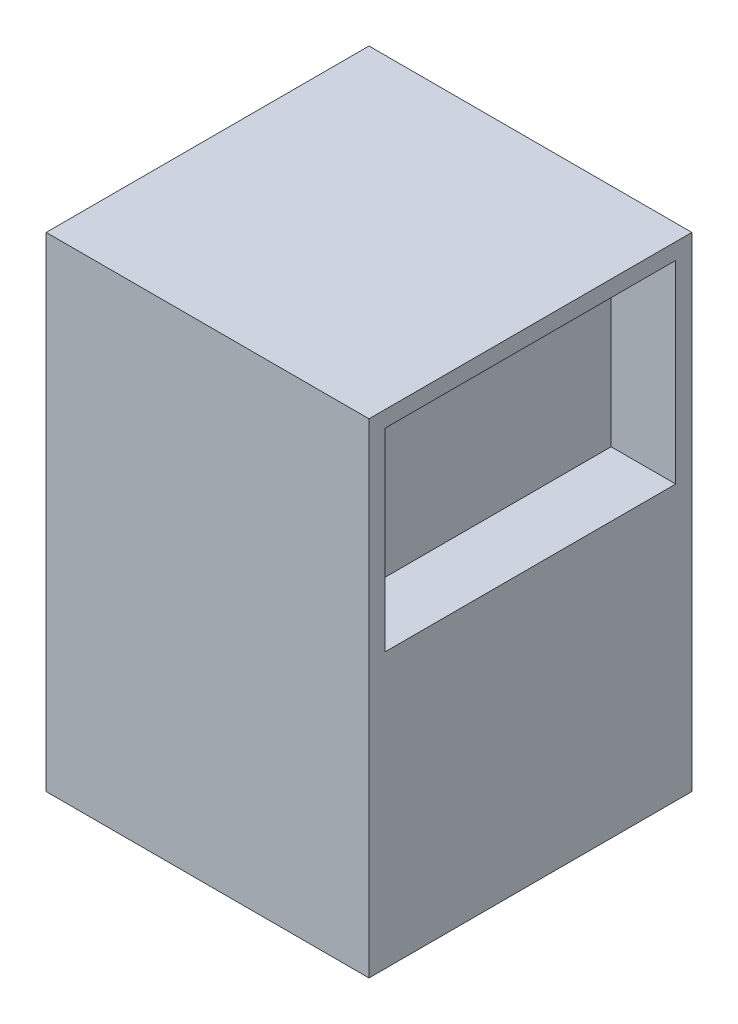
ISO-10303-21;
HEADER;
FILE_DESCRIPTION(('STEP AP214'),'2;1');
FILE_NAME('part.step','',(''),(''),'','','');
FILE_SCHEMA(('AUTOMOTIVE_DESIGN { 1 0 10303 214 1 1 1 1 }'));
ENDSEC;
DATA;
#1=APPLICATION_CONTEXT('core data for automotive mechanical design processes');
#2=APPLICATION_PROTOCOL_DEFINITION('international standard','automotive_design',2000,#1);
#3=PRODUCT_CONTEXT('',#1,'mechanical');
#4=PRODUCT('Part','Part','',(#3));
#5=PRODUCT_RELATED_PRODUCT_CATEGORY('part','',(#4));
#6=PRODUCT_DEFINITION_FORMATION('','',#4);
#7=PRODUCT_DEFINITION_CONTEXT('part definition',#1,'design');
#8=PRODUCT_DEFINITION('design','',#6,#7);
#9=PRODUCT_DEFINITION_SHAPE('','',#8);
#10=(LENGTH_UNIT() NAMED_UNIT(*) SI_UNIT(.MILLI.,.METRE.));
#11=(NAMED_UNIT(*) PLANE_ANGLE_UNIT() SI_UNIT($,.RADIAN.));
#12=(NAMED_UNIT(*) SI_UNIT($,.STERADIAN.) SOLID_ANGLE_UNIT());
#13=UNCERTAINTY_MEASURE_WITH_UNIT(LENGTH_MEASURE(1.E-05),#10,'distance_accuracy_value','');
#14=(GEOMETRIC_REPRESENTATION_CONTEXT(3) GLOBAL_UNCERTAINTY_ASSIGNED_CONTEXT((#13)) GLOBAL_UNIT_ASSIGNED_CONTEXT((#10,
#11,#12)) REPRESENTATION_CONTEXT('',''));
#15=CARTESIAN_POINT('',(0.,0.,0.));
#16=DIRECTION('',(0.,0.,1.));
#17=DIRECTION('',(1.,0.,0.));
#18=AXIS2_PLACEMENT_3D('',#15,#16,#17);
#19=CARTESIAN_POINT('',(-5.,8.82209169026397,-5.));
#20=DIRECTION('',(-1.,0.,0.));
#21=DIRECTION('',(0.,-1.,0.));
#22=AXIS2_PLACEMENT_3D('',#19,#20,#21);
#23=PLANE('',#22);
#24=DIRECTION('',(0.,0.,1.));
#25=VECTOR('',#24,1.);
#26=CARTESIAN_POINT('',(-5.,-6.17790830973602,-5.));
#27=LINE('',#26,#25);
#28=CARTESIAN_POINT('',(-5.,-6.17790830973602,-5.));
#29=VERTEX_POINT('',#28);
#30=CARTESIAN_POINT('',(-5.,-6.17790830973602,5.));
#31=VERTEX_POINT('',#30);
#32=EDGE_CURVE('E46',#29,#31,#27,.T.);
#33=ORIENTED_EDGE('',*,*,#32,.T.);
#34=DIRECTION('',(0.,-1.,0.));
#35=VECTOR('',#34,1.);
#36=CARTESIAN_POINT('',(-5.,8.82209169026397,5.));
#37=LINE('',#36,#35);
#38=CARTESIAN_POINT('',(-5.,8.82209169026397,5.));
#39=VERTEX_POINT('',#38);
#40=EDGE_CURVE('E154',#39,#31,#37,.T.);
#41=ORIENTED_EDGE('',*,*,#40,.F.);
#42=DIRECTION('',(0.,0.,1.));
#43=VECTOR('',#42,1.);
#44=CARTESIAN_POINT('',(-5.,8.82209169026397,-5.));
#45=LINE('',#44,#43);
#46=CARTESIAN_POINT('',(-5.,8.82209169026397,-5.));
#47=VERTEX_POINT('',#46);
#48=EDGE_CURVE('E11',#47,#39,#45,.T.);
#49=ORIENTED_EDGE('',*,*,#48,.F.);
#50=DIRECTION('',(0.,-1.,0.));
#51=VECTOR('',#50,1.);
#52=CARTESIAN_POINT('',(-5.,8.82209169026397,-5.));
#53=LINE('',#52,#51);
#54=EDGE_CURVE('E175',#47,#29,#53,.T.);
#55=ORIENTED_EDGE('',*,*,#54,.T.);
#56=EDGE_LOOP('',(#33,#41,#49,#55));
#57=FACE_BOUND('',#56,.T.);
#58=ADVANCED_FACE('F43',(#57),#23,.T.);
#59=CARTESIAN_POINT('',(-5.,8.82209169026397,-5.));
#60=DIRECTION('',(0.,1.,0.));
#61=DIRECTION('',(-1.,0.,0.));
#62=AXIS2_PLACEMENT_3D('',#59,#60,#61);
#63=PLANE('',#62);
#64=ORIENTED_EDGE('',*,*,#48,.T.);
#65=DIRECTION('',(-1.,0.,0.));
#66=VECTOR('',#65,1.);
#67=CARTESIAN_POINT('',(-5.,8.82209169026397,5.));
#68=LINE('',#67,#66);
#69=CARTESIAN_POINT('',(5.,8.82209169026397,5.));
#70=VERTEX_POINT('',#69);
#71=EDGE_CURVE('E171',#70,#39,#68,.T.);
#72=ORIENTED_EDGE('',*,*,#71,.F.);
#73=DIRECTION('',(0.,0.,1.));
#74=VECTOR('',#73,1.);
#75=CARTESIAN_POINT('',(5.,8.82209169026397,-5.));
#76=LINE('',#75,#74);
#77=CARTESIAN_POINT('',(5.,8.82209169026397,-5.));
#78=VERTEX_POINT('',#77);
#79=EDGE_CURVE('E52',#78,#70,#76,.T.);
#80=ORIENTED_EDGE('',*,*,#79,.F.);
#81=DIRECTION('',(-1.,0.,0.));
#82=VECTOR('',#81,1.);
#83=CARTESIAN_POINT('',(-5.,8.82209169026397,-5.));
#84=LINE('',#83,#82);
#85=EDGE_CURVE('E186',#78,#47,#84,.T.);
#86=ORIENTED_EDGE('',*,*,#85,.T.);
#87=EDGE_LOOP('',(#64,#72,#80,#86));
#88=FACE_BOUND('',#87,.T.);
#89=ADVANCED_FACE('F203',(#88),#63,.T.);
#90=CARTESIAN_POINT('',(5.,8.82209169026397,-5.));
#91=DIRECTION('',(1.,0.,0.));
#92=DIRECTION('',(0.,1.,0.));
#93=AXIS2_PLACEMENT_3D('',#90,#91,#92);
#94=PLANE('',#93);
#95=DIRECTION('',(0.,-1.,0.));
#96=VECTOR('',#95,1.);
#97=CARTESIAN_POINT('',(5.,8.32209169026397,4.5));
#98=LINE('',#97,#96);
#99=CARTESIAN_POINT('',(5.,8.32209169026397,4.5));
#100=VERTEX_POINT('',#99);
#101=CARTESIAN_POINT('',(5.,2.32209169026397,4.5));
#102=VERTEX_POINT('',#101);
#103=EDGE_CURVE('E60',#100,#102,#98,.T.);
#104=ORIENTED_EDGE('',*,*,#103,.F.);
#105=DIRECTION('',(0.,0.,1.));
#106=VECTOR('',#105,1.);
#107=CARTESIAN_POINT('',(5.,8.32209169026397,4.5));
#108=LINE('',#107,#106);
#109=CARTESIAN_POINT('',(5.,8.32209169026397,-4.5));
#110=VERTEX_POINT('',#109);
#111=EDGE_CURVE('E132',#110,#100,#108,.T.);
#112=ORIENTED_EDGE('',*,*,#111,.F.);
#113=DIRECTION('',(0.,1.,0.));
#114=VECTOR('',#113,1.);
#115=CARTESIAN_POINT('',(5.,8.32209169026397,-4.5));
#116=LINE('',#115,#114);
#117=CARTESIAN_POINT('',(5.,2.32209169026397,-4.5));
#118=VERTEX_POINT('',#117);
#119=EDGE_CURVE('E136',#118,#110,#116,.T.);
#120=ORIENTED_EDGE('',*,*,#119,.F.);
#121=DIRECTION('',(0.,0.,-1.));
#122=VECTOR('',#121,1.);
#123=CARTESIAN_POINT('',(5.,2.32209169026397,4.5));
#124=LINE('',#123,#122);
#125=EDGE_CURVE('E145',#102,#118,#124,.T.);
#126=ORIENTED_EDGE('',*,*,#125,.F.);
#127=EDGE_LOOP('',(#104,#112,#120,#126));
#128=FACE_BOUND('',#127,.T.);
#129=ORIENTED_EDGE('',*,*,#79,.T.);
#130=DIRECTION('',(0.,1.,0.));
#131=VECTOR('',#130,1.);
#132=CARTESIAN_POINT('',(5.,8.82209169026397,5.));
#133=LINE('',#132,#131);
#134=CARTESIAN_POINT('',(5.,-6.17790830973602,5.));
#135=VERTEX_POINT('',#134);
#136=EDGE_CURVE('E167',#135,#70,#133,.T.);
#137=ORIENTED_EDGE('',*,*,#136,.F.);
#138=DIRECTION('',(0.,0.,1.));
#139=VECTOR('',#138,1.);
#140=CARTESIAN_POINT('',(5.,-6.17790830973602,-5.));
#141=LINE('',#140,#139);
#142=CARTESIAN_POINT('',(5.,-6.17790830973602,-5.));
#143=VERTEX_POINT('',#142);
#144=EDGE_CURVE('E191',#143,#135,#141,.T.);
#145=ORIENTED_EDGE('',*,*,#144,.F.);
#146=DIRECTION('',(0.,1.,0.));
#147=VECTOR('',#146,1.);
#148=CARTESIAN_POINT('',(5.,8.82209169026397,-5.));
#149=LINE('',#148,#147);
#150=EDGE_CURVE('E182',#143,#78,#149,.T.);
#151=ORIENTED_EDGE('',*,*,#150,.T.);
#152=EDGE_LOOP('',(#129,#137,#145,#151));
#153=FACE_BOUND('',#152,.T.);
#154=ADVANCED_FACE('F209',(#128,#153),#94,.T.);
#155=CARTESIAN_POINT('',(-5.,-6.17790830973602,-5.));
#156=DIRECTION('',(0.,-1.,0.));
#157=DIRECTION('',(0.,0.,-1.));
#158=AXIS2_PLACEMENT_3D('',#155,#156,#157);
#159=PLANE('',#158);
#160=ORIENTED_EDGE('',*,*,#144,.T.);
#161=DIRECTION('',(1.,0.,0.));
#162=VECTOR('',#161,1.);
#163=CARTESIAN_POINT('',(-5.,-6.17790830973602,5.));
#164=LINE('',#163,#162);
#165=EDGE_CURVE('E163',#31,#135,#164,.T.);
#166=ORIENTED_EDGE('',*,*,#165,.F.);
#167=ORIENTED_EDGE('',*,*,#32,.F.);
#168=DIRECTION('',(1.,0.,0.));
#169=VECTOR('',#168,1.);
#170=CARTESIAN_POINT('',(-5.,-6.17790830973602,-5.));
#171=LINE('',#170,#169);
#172=EDGE_CURVE('E178',#29,#143,#171,.T.);
#173=ORIENTED_EDGE('',*,*,#172,.T.);
#174=EDGE_LOOP('',(#160,#166,#167,#173));
#175=FACE_BOUND('',#174,.T.);
#176=ADVANCED_FACE('F197',(#175),#159,.T.);
#177=CARTESIAN_POINT('',(0.,0.,-5.));
#178=DIRECTION('',(0.,0.,1.));
#179=DIRECTION('',(1.,0.,0.));
#180=AXIS2_PLACEMENT_3D('',#177,#178,#179);
#181=PLANE('',#180);
#182=ORIENTED_EDGE('',*,*,#54,.F.);
#183=ORIENTED_EDGE('',*,*,#85,.F.);
#184=ORIENTED_EDGE('',*,*,#150,.F.);
#185=ORIENTED_EDGE('',*,*,#172,.F.);
#186=EDGE_LOOP('',(#182,#183,#184,#185));
#187=FACE_BOUND('',#186,.T.);
#188=ADVANCED_FACE('F207',(#187),#181,.F.);
#189=CARTESIAN_POINT('',(0.,0.,5.));
#190=DIRECTION('',(0.,0.,1.));
#191=DIRECTION('',(1.,0.,0.));
#192=AXIS2_PLACEMENT_3D('',#189,#190,#191);
#193=PLANE('',#192);
#194=ORIENTED_EDGE('',*,*,#40,.T.);
#195=ORIENTED_EDGE('',*,*,#165,.T.);
#196=ORIENTED_EDGE('',*,*,#136,.T.);
#197=ORIENTED_EDGE('',*,*,#71,.T.);
#198=EDGE_LOOP('',(#194,#195,#196,#197));
#199=FACE_BOUND('',#198,.T.);
#200=ADVANCED_FACE('F200',(#199),#193,.T.);
#201=CARTESIAN_POINT('',(3.,8.32209169026397,4.5));
#202=DIRECTION('',(0.,0.,1.));
#203=DIRECTION('',(0.,-1.,0.));
#204=AXIS2_PLACEMENT_3D('',#201,#202,#203);
#205=PLANE('',#204);
#206=ORIENTED_EDGE('',*,*,#103,.T.);
#207=DIRECTION('',(1.,0.,0.));
#208=VECTOR('',#207,1.);
#209=CARTESIAN_POINT('',(3.,2.32209169026397,4.5));
#210=LINE('',#209,#208);
#211=CARTESIAN_POINT('',(3.,2.32209169026397,4.5));
#212=VERTEX_POINT('',#211);
#213=EDGE_CURVE('E107',#212,#102,#210,.T.);
#214=ORIENTED_EDGE('',*,*,#213,.F.);
#215=DIRECTION('',(0.,-1.,0.));
#216=VECTOR('',#215,1.);
#217=CARTESIAN_POINT('',(3.,8.32209169026397,4.5));
#218=LINE('',#217,#216);
#219=CARTESIAN_POINT('',(3.,8.32209169026397,4.5));
#220=VERTEX_POINT('',#219);
#221=EDGE_CURVE('E111',#220,#212,#218,.T.);
#222=ORIENTED_EDGE('',*,*,#221,.F.);
#223=DIRECTION('',(1.,0.,0.));
#224=VECTOR('',#223,1.);
#225=CARTESIAN_POINT('',(3.,8.32209169026397,4.5));
#226=LINE('',#225,#224);
#227=EDGE_CURVE('E151',#220,#100,#226,.T.);
#228=ORIENTED_EDGE('',*,*,#227,.T.);
#229=EDGE_LOOP('',(#206,#214,#222,#228));
#230=FACE_BOUND('',#229,.T.);
#231=ADVANCED_FACE('F109',(#230),#205,.F.);
#232=CARTESIAN_POINT('',(3.,8.32209169026397,4.5));
#233=DIRECTION('',(0.,1.,0.));
#234=DIRECTION('',(-1.,0.,0.));
#235=AXIS2_PLACEMENT_3D('',#232,#233,#234);
#236=PLANE('',#235);
#237=ORIENTED_EDGE('',*,*,#111,.T.);
#238=ORIENTED_EDGE('',*,*,#227,.F.);
#239=DIRECTION('',(0.,0.,1.));
#240=VECTOR('',#239,1.);
#241=CARTESIAN_POINT('',(3.,8.32209169026397,4.5));
#242=LINE('',#241,#240);
#243=CARTESIAN_POINT('',(3.,8.32209169026397,-4.5));
#244=VERTEX_POINT('',#243);
#245=EDGE_CURVE('E118',#244,#220,#242,.T.);
#246=ORIENTED_EDGE('',*,*,#245,.F.);
#247=DIRECTION('',(1.,0.,0.));
#248=VECTOR('',#247,1.);
#249=CARTESIAN_POINT('',(3.,8.32209169026397,-4.5));
#250=LINE('',#249,#248);
#251=EDGE_CURVE('E155',#244,#110,#250,.T.);
#252=ORIENTED_EDGE('',*,*,#251,.T.);
#253=EDGE_LOOP('',(#237,#238,#246,#252));
#254=FACE_BOUND('',#253,.T.);
#255=ADVANCED_FACE('F265',(#254),#236,.F.);
#256=CARTESIAN_POINT('',(3.,8.32209169026397,-4.5));
#257=DIRECTION('',(0.,0.,-1.));
#258=DIRECTION('',(0.,1.,0.));
#259=AXIS2_PLACEMENT_3D('',#256,#257,#258);
#260=PLANE('',#259);
#261=ORIENTED_EDGE('',*,*,#119,.T.);
#262=ORIENTED_EDGE('',*,*,#251,.F.);
#263=DIRECTION('',(0.,1.,0.));
#264=VECTOR('',#263,1.);
#265=CARTESIAN_POINT('',(3.,8.32209169026397,-4.5));
#266=LINE('',#265,#264);
#267=CARTESIAN_POINT('',(3.,2.32209169026397,-4.5));
#268=VERTEX_POINT('',#267);
#269=EDGE_CURVE('E127',#268,#244,#266,.T.);
#270=ORIENTED_EDGE('',*,*,#269,.F.);
#271=DIRECTION('',(1.,0.,0.));
#272=VECTOR('',#271,1.);
#273=CARTESIAN_POINT('',(3.,2.32209169026397,-4.5));
#274=LINE('',#273,#272);
#275=EDGE_CURVE('E117',#268,#118,#274,.T.);
#276=ORIENTED_EDGE('',*,*,#275,.T.);
#277=EDGE_LOOP('',(#261,#262,#270,#276));
#278=FACE_BOUND('',#277,.T.);
#279=ADVANCED_FACE('F275',(#278),#260,.F.);
#280=CARTESIAN_POINT('',(3.,2.32209169026397,4.5));
#281=DIRECTION('',(0.,-1.,0.));
#282=DIRECTION('',(1.,0.,0.));
#283=AXIS2_PLACEMENT_3D('',#280,#281,#282);
#284=PLANE('',#283);
#285=ORIENTED_EDGE('',*,*,#125,.T.);
#286=ORIENTED_EDGE('',*,*,#275,.F.);
#287=DIRECTION('',(0.,0.,-1.));
#288=VECTOR('',#287,1.);
#289=CARTESIAN_POINT('',(3.,2.32209169026397,4.5));
#290=LINE('',#289,#288);
#291=EDGE_CURVE('E121',#212,#268,#290,.T.);
#292=ORIENTED_EDGE('',*,*,#291,.F.);
#293=ORIENTED_EDGE('',*,*,#213,.T.);
#294=EDGE_LOOP('',(#285,#286,#292,#293));
#295=FACE_BOUND('',#294,.T.);
#296=ADVANCED_FACE('F122',(#295),#284,.F.);
#297=CARTESIAN_POINT('',(3.,0.,0.));
#298=DIRECTION('',(1.,0.,0.));
#299=DIRECTION('',(0.,1.,0.));
#300=AXIS2_PLACEMENT_3D('',#297,#298,#299);
#301=PLANE('',#300);
#302=ORIENTED_EDGE('',*,*,#221,.T.);
#303=ORIENTED_EDGE('',*,*,#291,.T.);
#304=ORIENTED_EDGE('',*,*,#269,.T.);
#305=ORIENTED_EDGE('',*,*,#245,.T.);
#306=EDGE_LOOP('',(#302,#303,#304,#305));
#307=FACE_BOUND('',#306,.T.);
#308=ADVANCED_FACE('F129',(#307),#301,.T.);
#309=CLOSED_SHELL('',(#58,#89,#154,#176,#188,#200,#231,#255,#279,#296,#308));
#310=MANIFOLD_SOLID_BREP('B2',#309);
#311=ADVANCED_BREP_SHAPE_REPRESENTATION('',(#18,#310),#14);
#312=SHAPE_DEFINITION_REPRESENTATION(#9,#311);
ENDSEC;
END-ISO-10303-21;
